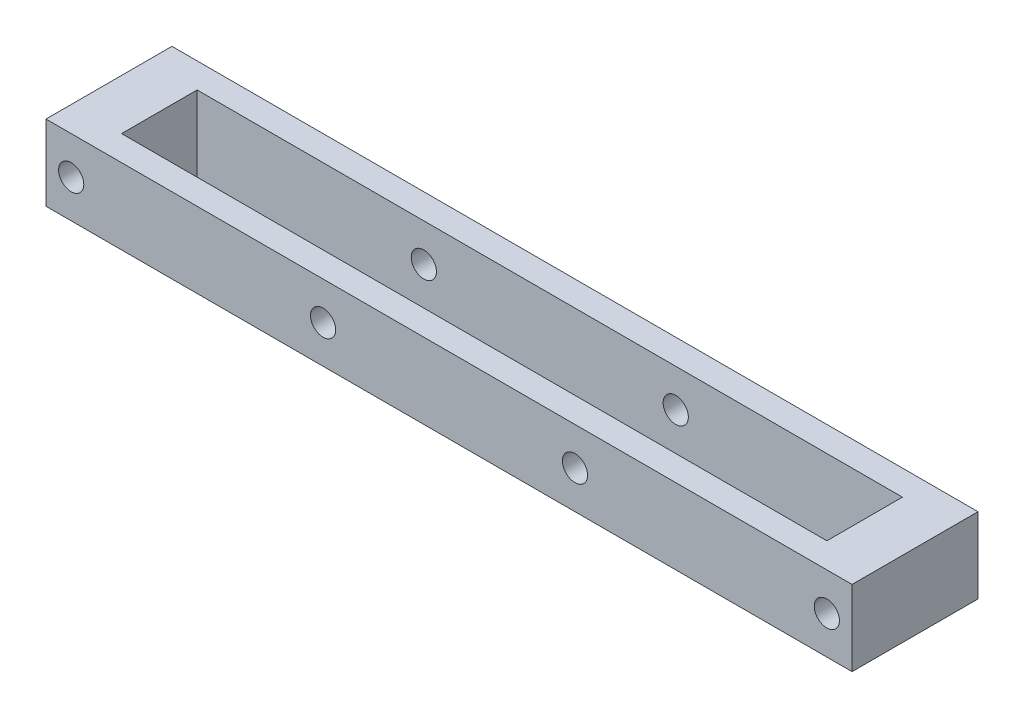
ISO-10303-21;
HEADER;
FILE_DESCRIPTION(('STEP AP214'),'2;1');
FILE_NAME('part.step','',(''),(''),'','','');
FILE_SCHEMA(('AUTOMOTIVE_DESIGN { 1 0 10303 214 1 1 1 1 }'));
ENDSEC;
DATA;
#1=APPLICATION_CONTEXT('core data for automotive mechanical design processes');
#2=APPLICATION_PROTOCOL_DEFINITION('international standard','automotive_design',2000,#1);
#3=PRODUCT_CONTEXT('',#1,'mechanical');
#4=PRODUCT('Part','Part','',(#3));
#5=PRODUCT_RELATED_PRODUCT_CATEGORY('part','',(#4));
#6=PRODUCT_DEFINITION_FORMATION('','',#4);
#7=PRODUCT_DEFINITION_CONTEXT('part definition',#1,'design');
#8=PRODUCT_DEFINITION('design','',#6,#7);
#9=PRODUCT_DEFINITION_SHAPE('','',#8);
#10=(LENGTH_UNIT() NAMED_UNIT(*) SI_UNIT(.MILLI.,.METRE.));
#11=(NAMED_UNIT(*) PLANE_ANGLE_UNIT() SI_UNIT($,.RADIAN.));
#12=(NAMED_UNIT(*) SI_UNIT($,.STERADIAN.) SOLID_ANGLE_UNIT());
#13=UNCERTAINTY_MEASURE_WITH_UNIT(LENGTH_MEASURE(1.E-05),#10,'distance_accuracy_value','');
#14=(GEOMETRIC_REPRESENTATION_CONTEXT(3) GLOBAL_UNCERTAINTY_ASSIGNED_CONTEXT((#13)) GLOBAL_UNIT_ASSIGNED_CONTEXT((#10,
#11,#12)) REPRESENTATION_CONTEXT('',''));
#15=CARTESIAN_POINT('',(0.,0.,0.));
#16=DIRECTION('',(0.,0.,1.));
#17=DIRECTION('',(1.,0.,0.));
#18=AXIS2_PLACEMENT_3D('',#15,#16,#17);
#19=CARTESIAN_POINT('',(160.,15.,25.));
#20=DIRECTION('',(-1.,0.,0.));
#21=DIRECTION('',(0.,0.,1.));
#22=AXIS2_PLACEMENT_3D('',#19,#20,#21);
#23=PLANE('',#22);
#24=DIRECTION('',(0.,1.,0.));
#25=VECTOR('',#24,1.);
#26=CARTESIAN_POINT('',(160.,15.,-25.));
#27=LINE('',#26,#25);
#28=CARTESIAN_POINT('',(160.,-15.,-25.));
#29=VERTEX_POINT('',#28);
#30=CARTESIAN_POINT('',(160.,15.,-25.));
#31=VERTEX_POINT('',#30);
#32=EDGE_CURVE('E163',#29,#31,#27,.T.);
#33=ORIENTED_EDGE('',*,*,#32,.T.);
#34=DIRECTION('',(0.,0.,-1.));
#35=VECTOR('',#34,1.);
#36=CARTESIAN_POINT('',(160.,15.,25.));
#37=LINE('',#36,#35);
#38=CARTESIAN_POINT('',(160.,15.,25.));
#39=VERTEX_POINT('',#38);
#40=EDGE_CURVE('E101',#39,#31,#37,.T.);
#41=ORIENTED_EDGE('',*,*,#40,.F.);
#42=DIRECTION('',(0.,1.,0.));
#43=VECTOR('',#42,1.);
#44=CARTESIAN_POINT('',(160.,15.,25.));
#45=LINE('',#44,#43);
#46=CARTESIAN_POINT('',(160.,-15.,25.));
#47=VERTEX_POINT('',#46);
#48=EDGE_CURVE('E164',#47,#39,#45,.T.);
#49=ORIENTED_EDGE('',*,*,#48,.F.);
#50=DIRECTION('',(0.,0.,-1.));
#51=VECTOR('',#50,1.);
#52=CARTESIAN_POINT('',(160.,-15.,25.));
#53=LINE('',#52,#51);
#54=EDGE_CURVE('E174',#47,#29,#53,.T.);
#55=ORIENTED_EDGE('',*,*,#54,.T.);
#56=EDGE_LOOP('',(#33,#41,#49,#55));
#57=FACE_BOUND('',#56,.T.);
#58=ADVANCED_FACE('F33',(#57),#23,.F.);
#59=CARTESIAN_POINT('',(-160.,15.,25.));
#60=DIRECTION('',(0.,-1.,0.));
#61=DIRECTION('',(0.,0.,-1.));
#62=AXIS2_PLACEMENT_3D('',#59,#60,#61);
#63=PLANE('',#62);
#64=DIRECTION('',(1.,0.,0.));
#65=VECTOR('',#64,1.);
#66=CARTESIAN_POINT('',(-160.,15.,-15.));
#67=LINE('',#66,#65);
#68=CARTESIAN_POINT('',(-140.,15.,-15.));
#69=VERTEX_POINT('',#68);
#70=CARTESIAN_POINT('',(140.,15.,-15.));
#71=VERTEX_POINT('',#70);
#72=EDGE_CURVE('E151',#69,#71,#67,.T.);
#73=ORIENTED_EDGE('',*,*,#72,.T.);
#74=DIRECTION('',(0.,0.,1.));
#75=VECTOR('',#74,1.);
#76=CARTESIAN_POINT('',(140.,15.,25.));
#77=LINE('',#76,#75);
#78=CARTESIAN_POINT('',(140.,15.,15.));
#79=VERTEX_POINT('',#78);
#80=EDGE_CURVE('E108',#71,#79,#77,.T.);
#81=ORIENTED_EDGE('',*,*,#80,.T.);
#82=DIRECTION('',(-1.,0.,0.));
#83=VECTOR('',#82,1.);
#84=CARTESIAN_POINT('',(-160.,15.,15.));
#85=LINE('',#84,#83);
#86=CARTESIAN_POINT('',(-140.,15.,15.));
#87=VERTEX_POINT('',#86);
#88=EDGE_CURVE('E159',#79,#87,#85,.T.);
#89=ORIENTED_EDGE('',*,*,#88,.T.);
#90=DIRECTION('',(0.,0.,-1.));
#91=VECTOR('',#90,1.);
#92=CARTESIAN_POINT('',(-140.,15.,25.));
#93=LINE('',#92,#91);
#94=EDGE_CURVE('E156',#87,#69,#93,.T.);
#95=ORIENTED_EDGE('',*,*,#94,.T.);
#96=EDGE_LOOP('',(#73,#81,#89,#95));
#97=FACE_BOUND('',#96,.T.);
#98=DIRECTION('',(-1.,0.,0.));
#99=VECTOR('',#98,1.);
#100=CARTESIAN_POINT('',(-160.,15.,-25.));
#101=LINE('',#100,#99);
#102=CARTESIAN_POINT('',(-160.,15.,-25.));
#103=VERTEX_POINT('',#102);
#104=EDGE_CURVE('E177',#31,#103,#101,.T.);
#105=ORIENTED_EDGE('',*,*,#104,.T.);
#106=DIRECTION('',(0.,0.,-1.));
#107=VECTOR('',#106,1.);
#108=CARTESIAN_POINT('',(-160.,15.,25.));
#109=LINE('',#108,#107);
#110=CARTESIAN_POINT('',(-160.,15.,25.));
#111=VERTEX_POINT('',#110);
#112=EDGE_CURVE('E187',#111,#103,#109,.T.);
#113=ORIENTED_EDGE('',*,*,#112,.F.);
#114=DIRECTION('',(-1.,0.,0.));
#115=VECTOR('',#114,1.);
#116=CARTESIAN_POINT('',(-160.,15.,25.));
#117=LINE('',#116,#115);
#118=EDGE_CURVE('E167',#39,#111,#117,.T.);
#119=ORIENTED_EDGE('',*,*,#118,.F.);
#120=ORIENTED_EDGE('',*,*,#40,.T.);
#121=EDGE_LOOP('',(#105,#113,#119,#120));
#122=FACE_BOUND('',#121,.T.);
#123=ADVANCED_FACE('F193',(#97,#122),#63,.F.);
#124=CARTESIAN_POINT('',(-160.,15.,25.));
#125=DIRECTION('',(1.,0.,0.));
#126=DIRECTION('',(0.,0.,-1.));
#127=AXIS2_PLACEMENT_3D('',#124,#125,#126);
#128=PLANE('',#127);
#129=DIRECTION('',(0.,-1.,0.));
#130=VECTOR('',#129,1.);
#131=CARTESIAN_POINT('',(-160.,15.,-25.));
#132=LINE('',#131,#130);
#133=CARTESIAN_POINT('',(-160.,-15.,-25.));
#134=VERTEX_POINT('',#133);
#135=EDGE_CURVE('E179',#103,#134,#132,.T.);
#136=ORIENTED_EDGE('',*,*,#135,.T.);
#137=DIRECTION('',(0.,0.,-1.));
#138=VECTOR('',#137,1.);
#139=CARTESIAN_POINT('',(-160.,-15.,25.));
#140=LINE('',#139,#138);
#141=CARTESIAN_POINT('',(-160.,-15.,25.));
#142=VERTEX_POINT('',#141);
#143=EDGE_CURVE('E184',#142,#134,#140,.T.);
#144=ORIENTED_EDGE('',*,*,#143,.F.);
#145=DIRECTION('',(0.,-1.,0.));
#146=VECTOR('',#145,1.);
#147=CARTESIAN_POINT('',(-160.,15.,25.));
#148=LINE('',#147,#146);
#149=EDGE_CURVE('E170',#111,#142,#148,.T.);
#150=ORIENTED_EDGE('',*,*,#149,.F.);
#151=ORIENTED_EDGE('',*,*,#112,.T.);
#152=EDGE_LOOP('',(#136,#144,#150,#151));
#153=FACE_BOUND('',#152,.T.);
#154=ADVANCED_FACE('F205',(#153),#128,.F.);
#155=CARTESIAN_POINT('',(-160.,-15.,25.));
#156=DIRECTION('',(0.,1.,0.));
#157=DIRECTION('',(0.,0.,1.));
#158=AXIS2_PLACEMENT_3D('',#155,#156,#157);
#159=PLANE('',#158);
#160=DIRECTION('',(1.,0.,0.));
#161=VECTOR('',#160,1.);
#162=CARTESIAN_POINT('',(-160.,-15.,15.));
#163=LINE('',#162,#161);
#164=CARTESIAN_POINT('',(-140.,-15.,15.));
#165=VERTEX_POINT('',#164);
#166=CARTESIAN_POINT('',(140.,-15.,15.));
#167=VERTEX_POINT('',#166);
#168=EDGE_CURVE('E41',#165,#167,#163,.T.);
#169=ORIENTED_EDGE('',*,*,#168,.T.);
#170=DIRECTION('',(0.,0.,-1.));
#171=VECTOR('',#170,1.);
#172=CARTESIAN_POINT('',(140.,-15.,25.));
#173=LINE('',#172,#171);
#174=CARTESIAN_POINT('',(140.,-15.,-15.));
#175=VERTEX_POINT('',#174);
#176=EDGE_CURVE('E11',#167,#175,#173,.T.);
#177=ORIENTED_EDGE('',*,*,#176,.T.);
#178=DIRECTION('',(-1.,0.,0.));
#179=VECTOR('',#178,1.);
#180=CARTESIAN_POINT('',(-160.,-15.,-15.));
#181=LINE('',#180,#179);
#182=CARTESIAN_POINT('',(-140.,-15.,-15.));
#183=VERTEX_POINT('',#182);
#184=EDGE_CURVE('E96',#175,#183,#181,.T.);
#185=ORIENTED_EDGE('',*,*,#184,.T.);
#186=DIRECTION('',(0.,0.,1.));
#187=VECTOR('',#186,1.);
#188=CARTESIAN_POINT('',(-140.,-15.,25.));
#189=LINE('',#188,#187);
#190=EDGE_CURVE('E100',#183,#165,#189,.T.);
#191=ORIENTED_EDGE('',*,*,#190,.T.);
#192=EDGE_LOOP('',(#169,#177,#185,#191));
#193=FACE_BOUND('',#192,.T.);
#194=DIRECTION('',(1.,0.,0.));
#195=VECTOR('',#194,1.);
#196=CARTESIAN_POINT('',(-160.,-15.,-25.));
#197=LINE('',#196,#195);
#198=EDGE_CURVE('E168',#134,#29,#197,.T.);
#199=ORIENTED_EDGE('',*,*,#198,.T.);
#200=ORIENTED_EDGE('',*,*,#54,.F.);
#201=DIRECTION('',(1.,0.,0.));
#202=VECTOR('',#201,1.);
#203=CARTESIAN_POINT('',(-160.,-15.,25.));
#204=LINE('',#203,#202);
#205=EDGE_CURVE('E172',#142,#47,#204,.T.);
#206=ORIENTED_EDGE('',*,*,#205,.F.);
#207=ORIENTED_EDGE('',*,*,#143,.T.);
#208=EDGE_LOOP('',(#199,#200,#206,#207));
#209=FACE_BOUND('',#208,.T.);
#210=ADVANCED_FACE('F113',(#193,#209),#159,.F.);
#211=CARTESIAN_POINT('',(0.,0.,25.));
#212=DIRECTION('',(0.,0.,1.));
#213=DIRECTION('',(1.,0.,0.));
#214=AXIS2_PLACEMENT_3D('',#211,#212,#213);
#215=PLANE('',#214);
#216=CARTESIAN_POINT('',(50.,0.,25.));
#217=DIRECTION('',(0.,0.,1.));
#218=DIRECTION('',(1.,0.,0.));
#219=AXIS2_PLACEMENT_3D('',#216,#217,#218);
#220=CIRCLE('',#219,5.);
#221=CARTESIAN_POINT('',(55.,0.,25.));
#222=VERTEX_POINT('',#221);
#223=EDGE_CURVE('E261',#222,#222,#220,.T.);
#224=ORIENTED_EDGE('',*,*,#223,.F.);
#225=EDGE_LOOP('',(#224));
#226=FACE_BOUND('',#225,.T.);
#227=CARTESIAN_POINT('',(-49.9999999999999,0.,25.));
#228=DIRECTION('',(0.,0.,1.));
#229=DIRECTION('',(1.,0.,0.));
#230=AXIS2_PLACEMENT_3D('',#227,#228,#229);
#231=CIRCLE('',#230,5.);
#232=CARTESIAN_POINT('',(-44.9999999999999,0.,25.));
#233=VERTEX_POINT('',#232);
#234=EDGE_CURVE('E130',#233,#233,#231,.T.);
#235=ORIENTED_EDGE('',*,*,#234,.F.);
#236=EDGE_LOOP('',(#235));
#237=FACE_BOUND('',#236,.T.);
#238=CARTESIAN_POINT('',(150.,0.,25.));
#239=DIRECTION('',(0.,0.,1.));
#240=DIRECTION('',(1.,0.,0.));
#241=AXIS2_PLACEMENT_3D('',#238,#239,#240);
#242=CIRCLE('',#241,4.99999999999999);
#243=CARTESIAN_POINT('',(155.,0.,25.));
#244=VERTEX_POINT('',#243);
#245=EDGE_CURVE('E127',#244,#244,#242,.T.);
#246=ORIENTED_EDGE('',*,*,#245,.F.);
#247=EDGE_LOOP('',(#246));
#248=FACE_BOUND('',#247,.T.);
#249=CARTESIAN_POINT('',(-150.,0.,25.));
#250=DIRECTION('',(0.,0.,1.));
#251=DIRECTION('',(1.,0.,0.));
#252=AXIS2_PLACEMENT_3D('',#249,#250,#251);
#253=CIRCLE('',#252,4.99999999999999);
#254=CARTESIAN_POINT('',(-145.,0.,25.));
#255=VERTEX_POINT('',#254);
#256=EDGE_CURVE('E144',#255,#255,#253,.T.);
#257=ORIENTED_EDGE('',*,*,#256,.F.);
#258=EDGE_LOOP('',(#257));
#259=FACE_BOUND('',#258,.T.);
#260=ORIENTED_EDGE('',*,*,#48,.T.);
#261=ORIENTED_EDGE('',*,*,#118,.T.);
#262=ORIENTED_EDGE('',*,*,#149,.T.);
#263=ORIENTED_EDGE('',*,*,#205,.T.);
#264=EDGE_LOOP('',(#260,#261,#262,#263));
#265=FACE_BOUND('',#264,.T.);
#266=ADVANCED_FACE('F209',(#226,#237,#248,#259,#265),#215,.T.);
#267=CARTESIAN_POINT('',(0.,0.,-25.));
#268=DIRECTION('',(0.,0.,1.));
#269=DIRECTION('',(1.,0.,0.));
#270=AXIS2_PLACEMENT_3D('',#267,#268,#269);
#271=PLANE('',#270);
#272=CARTESIAN_POINT('',(50.,0.,-25.));
#273=DIRECTION('',(0.,0.,1.));
#274=DIRECTION('',(1.,0.,0.));
#275=AXIS2_PLACEMENT_3D('',#272,#273,#274);
#276=CIRCLE('',#275,5.);
#277=CARTESIAN_POINT('',(55.,0.,-25.));
#278=VERTEX_POINT('',#277);
#279=EDGE_CURVE('E259',#278,#278,#276,.T.);
#280=ORIENTED_EDGE('',*,*,#279,.T.);
#281=EDGE_LOOP('',(#280));
#282=FACE_BOUND('',#281,.T.);
#283=CARTESIAN_POINT('',(-49.9999999999999,0.,-25.));
#284=DIRECTION('',(0.,0.,1.));
#285=DIRECTION('',(1.,0.,0.));
#286=AXIS2_PLACEMENT_3D('',#283,#284,#285);
#287=CIRCLE('',#286,5.);
#288=CARTESIAN_POINT('',(-44.9999999999999,0.,-25.));
#289=VERTEX_POINT('',#288);
#290=EDGE_CURVE('E123',#289,#289,#287,.T.);
#291=ORIENTED_EDGE('',*,*,#290,.T.);
#292=EDGE_LOOP('',(#291));
#293=FACE_BOUND('',#292,.T.);
#294=CARTESIAN_POINT('',(150.,0.,-25.));
#295=DIRECTION('',(0.,0.,1.));
#296=DIRECTION('',(1.,0.,0.));
#297=AXIS2_PLACEMENT_3D('',#294,#295,#296);
#298=CIRCLE('',#297,4.99999999999999);
#299=CARTESIAN_POINT('',(155.,0.,-25.));
#300=VERTEX_POINT('',#299);
#301=EDGE_CURVE('E141',#300,#300,#298,.T.);
#302=ORIENTED_EDGE('',*,*,#301,.T.);
#303=EDGE_LOOP('',(#302));
#304=FACE_BOUND('',#303,.T.);
#305=CARTESIAN_POINT('',(-150.,0.,-25.));
#306=DIRECTION('',(0.,0.,1.));
#307=DIRECTION('',(1.,0.,0.));
#308=AXIS2_PLACEMENT_3D('',#305,#306,#307);
#309=CIRCLE('',#308,4.99999999999999);
#310=CARTESIAN_POINT('',(-145.,0.,-25.));
#311=VERTEX_POINT('',#310);
#312=EDGE_CURVE('E110',#311,#311,#309,.T.);
#313=ORIENTED_EDGE('',*,*,#312,.T.);
#314=EDGE_LOOP('',(#313));
#315=FACE_BOUND('',#314,.T.);
#316=ORIENTED_EDGE('',*,*,#32,.F.);
#317=ORIENTED_EDGE('',*,*,#198,.F.);
#318=ORIENTED_EDGE('',*,*,#135,.F.);
#319=ORIENTED_EDGE('',*,*,#104,.F.);
#320=EDGE_LOOP('',(#316,#317,#318,#319));
#321=FACE_BOUND('',#320,.T.);
#322=ADVANCED_FACE('F201',(#282,#293,#304,#315,#321),#271,.F.);
#323=CARTESIAN_POINT('',(140.,-25.,-15.));
#324=DIRECTION('',(1.,0.,0.));
#325=DIRECTION('',(0.,0.,-1.));
#326=AXIS2_PLACEMENT_3D('',#323,#324,#325);
#327=PLANE('',#326);
#328=DIRECTION('',(0.,1.,0.));
#329=VECTOR('',#328,1.);
#330=CARTESIAN_POINT('',(140.,-25.,-15.));
#331=LINE('',#330,#329);
#332=EDGE_CURVE('E49',#175,#71,#331,.T.);
#333=ORIENTED_EDGE('',*,*,#332,.F.);
#334=ORIENTED_EDGE('',*,*,#176,.F.);
#335=DIRECTION('',(0.,1.,0.));
#336=VECTOR('',#335,1.);
#337=CARTESIAN_POINT('',(140.,-25.,15.));
#338=LINE('',#337,#336);
#339=EDGE_CURVE('E149',#167,#79,#338,.T.);
#340=ORIENTED_EDGE('',*,*,#339,.T.);
#341=ORIENTED_EDGE('',*,*,#80,.F.);
#342=EDGE_LOOP('',(#333,#334,#340,#341));
#343=FACE_BOUND('',#342,.T.);
#344=ADVANCED_FACE('F104',(#343),#327,.F.);
#345=CARTESIAN_POINT('',(-140.,-25.,15.));
#346=DIRECTION('',(0.,0.,1.));
#347=DIRECTION('',(1.,0.,0.));
#348=AXIS2_PLACEMENT_3D('',#345,#346,#347);
#349=PLANE('',#348);
#350=CARTESIAN_POINT('',(50.,0.,15.));
#351=DIRECTION('',(0.,0.,1.));
#352=DIRECTION('',(1.,0.,0.));
#353=AXIS2_PLACEMENT_3D('',#350,#351,#352);
#354=CIRCLE('',#353,5.);
#355=CARTESIAN_POINT('',(55.,0.,15.));
#356=VERTEX_POINT('',#355);
#357=EDGE_CURVE('E135',#356,#356,#354,.T.);
#358=ORIENTED_EDGE('',*,*,#357,.T.);
#359=EDGE_LOOP('',(#358));
#360=FACE_BOUND('',#359,.T.);
#361=CARTESIAN_POINT('',(-49.9999999999999,0.,15.));
#362=DIRECTION('',(0.,0.,1.));
#363=DIRECTION('',(1.,0.,0.));
#364=AXIS2_PLACEMENT_3D('',#361,#362,#363);
#365=CIRCLE('',#364,5.);
#366=CARTESIAN_POINT('',(-44.9999999999999,0.,15.));
#367=VERTEX_POINT('',#366);
#368=EDGE_CURVE('E122',#367,#367,#365,.T.);
#369=ORIENTED_EDGE('',*,*,#368,.T.);
#370=EDGE_LOOP('',(#369));
#371=FACE_BOUND('',#370,.T.);
#372=ORIENTED_EDGE('',*,*,#339,.F.);
#373=ORIENTED_EDGE('',*,*,#168,.F.);
#374=DIRECTION('',(0.,1.,0.));
#375=VECTOR('',#374,1.);
#376=CARTESIAN_POINT('',(-140.,-25.,15.));
#377=LINE('',#376,#375);
#378=EDGE_CURVE('E152',#165,#87,#377,.T.);
#379=ORIENTED_EDGE('',*,*,#378,.T.);
#380=ORIENTED_EDGE('',*,*,#88,.F.);
#381=EDGE_LOOP('',(#372,#373,#379,#380));
#382=FACE_BOUND('',#381,.T.);
#383=ADVANCED_FACE('F234',(#360,#371,#382),#349,.F.);
#384=CARTESIAN_POINT('',(-140.,-25.,-15.));
#385=DIRECTION('',(-1.,0.,0.));
#386=DIRECTION('',(0.,0.,1.));
#387=AXIS2_PLACEMENT_3D('',#384,#385,#386);
#388=PLANE('',#387);
#389=ORIENTED_EDGE('',*,*,#378,.F.);
#390=ORIENTED_EDGE('',*,*,#190,.F.);
#391=DIRECTION('',(0.,1.,0.));
#392=VECTOR('',#391,1.);
#393=CARTESIAN_POINT('',(-140.,-25.,-15.));
#394=LINE('',#393,#392);
#395=EDGE_CURVE('E54',#183,#69,#394,.T.);
#396=ORIENTED_EDGE('',*,*,#395,.T.);
#397=ORIENTED_EDGE('',*,*,#94,.F.);
#398=EDGE_LOOP('',(#389,#390,#396,#397));
#399=FACE_BOUND('',#398,.T.);
#400=ADVANCED_FACE('F233',(#399),#388,.F.);
#401=CARTESIAN_POINT('',(-140.,-25.,-15.));
#402=DIRECTION('',(0.,0.,-1.));
#403=DIRECTION('',(-1.,0.,0.));
#404=AXIS2_PLACEMENT_3D('',#401,#402,#403);
#405=PLANE('',#404);
#406=CARTESIAN_POINT('',(50.,0.,-15.));
#407=DIRECTION('',(0.,0.,-1.));
#408=DIRECTION('',(-1.,0.,0.));
#409=AXIS2_PLACEMENT_3D('',#406,#407,#408);
#410=CIRCLE('',#409,5.);
#411=CARTESIAN_POINT('',(45.,0.,-15.));
#412=VERTEX_POINT('',#411);
#413=EDGE_CURVE('E36',#412,#412,#410,.T.);
#414=ORIENTED_EDGE('',*,*,#413,.T.);
#415=EDGE_LOOP('',(#414));
#416=FACE_BOUND('',#415,.T.);
#417=CARTESIAN_POINT('',(-49.9999999999999,0.,-15.));
#418=DIRECTION('',(0.,0.,-1.));
#419=DIRECTION('',(-1.,0.,0.));
#420=AXIS2_PLACEMENT_3D('',#417,#418,#419);
#421=CIRCLE('',#420,5.);
#422=CARTESIAN_POINT('',(-54.9999999999999,0.,-15.));
#423=VERTEX_POINT('',#422);
#424=EDGE_CURVE('E120',#423,#423,#421,.T.);
#425=ORIENTED_EDGE('',*,*,#424,.T.);
#426=EDGE_LOOP('',(#425));
#427=FACE_BOUND('',#426,.T.);
#428=ORIENTED_EDGE('',*,*,#395,.F.);
#429=ORIENTED_EDGE('',*,*,#184,.F.);
#430=ORIENTED_EDGE('',*,*,#332,.T.);
#431=ORIENTED_EDGE('',*,*,#72,.F.);
#432=EDGE_LOOP('',(#428,#429,#430,#431));
#433=FACE_BOUND('',#432,.T.);
#434=ADVANCED_FACE('F97',(#416,#427,#433),#405,.F.);
#435=CARTESIAN_POINT('',(-150.,0.,-25.));
#436=DIRECTION('',(0.,0.,1.));
#437=DIRECTION('',(1.,0.,0.));
#438=AXIS2_PLACEMENT_3D('',#435,#436,#437);
#439=CYLINDRICAL_SURFACE('',#438,4.99999999999999);
#440=ORIENTED_EDGE('',*,*,#312,.F.);
#441=EDGE_LOOP('',(#440));
#442=FACE_BOUND('',#441,.T.);
#443=ORIENTED_EDGE('',*,*,#256,.T.);
#444=EDGE_LOOP('',(#443));
#445=FACE_BOUND('',#444,.T.);
#446=ADVANCED_FACE('F246',(#442,#445),#439,.F.);
#447=CARTESIAN_POINT('',(150.,0.,-25.));
#448=DIRECTION('',(0.,0.,1.));
#449=DIRECTION('',(1.,0.,0.));
#450=AXIS2_PLACEMENT_3D('',#447,#448,#449);
#451=CYLINDRICAL_SURFACE('',#450,4.99999999999999);
#452=ORIENTED_EDGE('',*,*,#301,.F.);
#453=EDGE_LOOP('',(#452));
#454=FACE_BOUND('',#453,.T.);
#455=ORIENTED_EDGE('',*,*,#245,.T.);
#456=EDGE_LOOP('',(#455));
#457=FACE_BOUND('',#456,.T.);
#458=ADVANCED_FACE('F254',(#454,#457),#451,.F.);
#459=CARTESIAN_POINT('',(-49.9999999999999,0.,-25.));
#460=DIRECTION('',(0.,0.,1.));
#461=DIRECTION('',(1.,0.,0.));
#462=AXIS2_PLACEMENT_3D('',#459,#460,#461);
#463=CYLINDRICAL_SURFACE('',#462,5.);
#464=ORIENTED_EDGE('',*,*,#290,.F.);
#465=EDGE_LOOP('',(#464));
#466=FACE_BOUND('',#465,.T.);
#467=ORIENTED_EDGE('',*,*,#424,.F.);
#468=EDGE_LOOP('',(#467));
#469=FACE_BOUND('',#468,.T.);
#470=ADVANCED_FACE('F280',(#466,#469),#463,.F.);
#471=ORIENTED_EDGE('',*,*,#234,.T.);
#472=EDGE_LOOP('',(#471));
#473=FACE_BOUND('',#472,.T.);
#474=ORIENTED_EDGE('',*,*,#368,.F.);
#475=EDGE_LOOP('',(#474));
#476=FACE_BOUND('',#475,.T.);
#477=ADVANCED_FACE('F276',(#473,#476),#463,.F.);
#478=CARTESIAN_POINT('',(50.,0.,-25.));
#479=DIRECTION('',(0.,0.,1.));
#480=DIRECTION('',(1.,0.,0.));
#481=AXIS2_PLACEMENT_3D('',#478,#479,#480);
#482=CYLINDRICAL_SURFACE('',#481,5.);
#483=ORIENTED_EDGE('',*,*,#279,.F.);
#484=EDGE_LOOP('',(#483));
#485=FACE_BOUND('',#484,.T.);
#486=ORIENTED_EDGE('',*,*,#413,.F.);
#487=EDGE_LOOP('',(#486));
#488=FACE_BOUND('',#487,.T.);
#489=ADVANCED_FACE('F270',(#485,#488),#482,.F.);
#490=ORIENTED_EDGE('',*,*,#223,.T.);
#491=EDGE_LOOP('',(#490));
#492=FACE_BOUND('',#491,.T.);
#493=ORIENTED_EDGE('',*,*,#357,.F.);
#494=EDGE_LOOP('',(#493));
#495=FACE_BOUND('',#494,.T.);
#496=ADVANCED_FACE('F267',(#492,#495),#482,.F.);
#497=CLOSED_SHELL('',(#58,#123,#154,#210,#266,#322,#344,#383,#400,#434,#446,#458,#470,#477,#489,#496));
#498=MANIFOLD_SOLID_BREP('B2',#497);
#499=ADVANCED_BREP_SHAPE_REPRESENTATION('',(#18,#498),#14);
#500=SHAPE_DEFINITION_REPRESENTATION(#9,#499);
ENDSEC;
END-ISO-10303-21;
